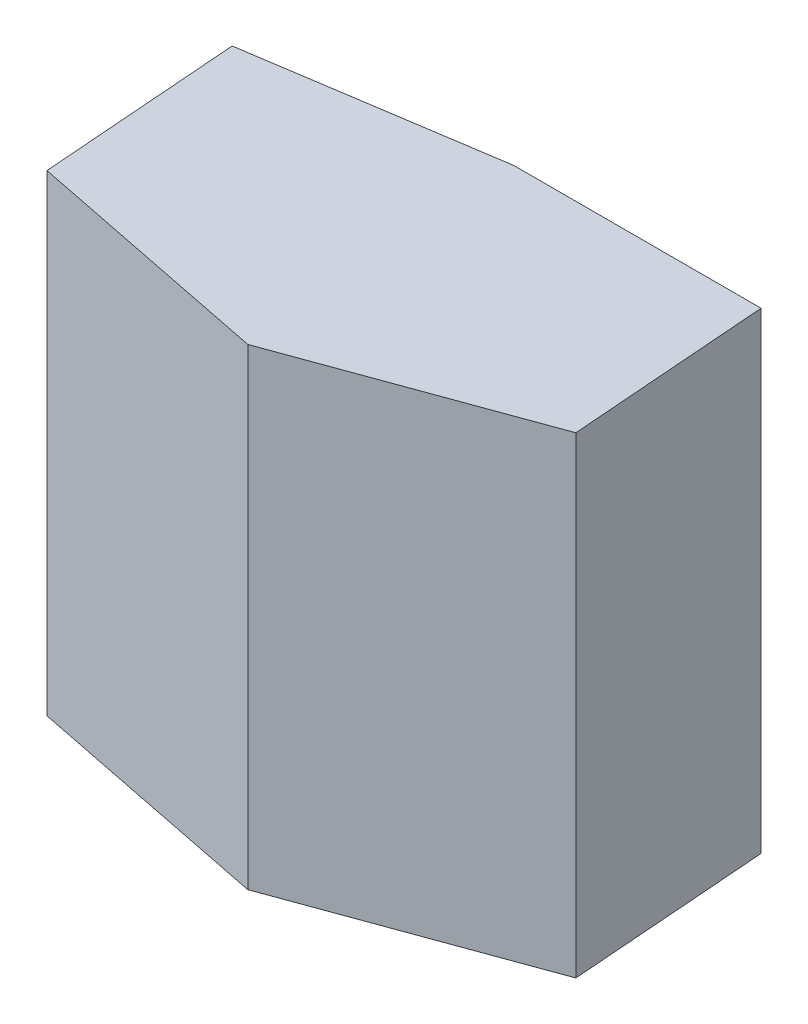
ISO-10303-21;
HEADER;
FILE_DESCRIPTION(('STEP AP214'),'2;1');
FILE_NAME('part.step','',(''),(''),'','','');
FILE_SCHEMA(('AUTOMOTIVE_DESIGN { 1 0 10303 214 1 1 1 1 }'));
ENDSEC;
DATA;
#1=APPLICATION_CONTEXT('core data for automotive mechanical design processes');
#2=APPLICATION_PROTOCOL_DEFINITION('international standard','automotive_design',2000,#1);
#3=PRODUCT_CONTEXT('',#1,'mechanical');
#4=PRODUCT('Part','Part','',(#3));
#5=PRODUCT_RELATED_PRODUCT_CATEGORY('part','',(#4));
#6=PRODUCT_DEFINITION_FORMATION('','',#4);
#7=PRODUCT_DEFINITION_CONTEXT('part definition',#1,'design');
#8=PRODUCT_DEFINITION('design','',#6,#7);
#9=PRODUCT_DEFINITION_SHAPE('','',#8);
#10=(LENGTH_UNIT() NAMED_UNIT(*) SI_UNIT(.MILLI.,.METRE.));
#11=(NAMED_UNIT(*) PLANE_ANGLE_UNIT() SI_UNIT($,.RADIAN.));
#12=(NAMED_UNIT(*) SI_UNIT($,.STERADIAN.) SOLID_ANGLE_UNIT());
#13=UNCERTAINTY_MEASURE_WITH_UNIT(LENGTH_MEASURE(1.E-05),#10,'distance_accuracy_value','');
#14=(GEOMETRIC_REPRESENTATION_CONTEXT(3) GLOBAL_UNCERTAINTY_ASSIGNED_CONTEXT((#13)) GLOBAL_UNIT_ASSIGNED_CONTEXT((#10,
#11,#12)) REPRESENTATION_CONTEXT('',''));
#15=CARTESIAN_POINT('',(0.,0.,0.));
#16=DIRECTION('',(0.,0.,1.));
#17=DIRECTION('',(1.,0.,0.));
#18=AXIS2_PLACEMENT_3D('',#15,#16,#17);
#19=CARTESIAN_POINT('',(-15.1608957547809,6.5,5.51811477955297));
#20=DIRECTION('',(-0.342020143325662,0.,-0.939692620785911));
#21=DIRECTION('',(-0.939692620785911,0.,0.342020143325662));
#22=AXIS2_PLACEMENT_3D('',#19,#20,#21);
#23=PLANE('',#22);
#24=DIRECTION('',(0.939692620785911,0.,-0.342020143325662));
#25=VECTOR('',#24,1.);
#26=CARTESIAN_POINT('',(-15.1608957547809,-6.5,5.51811477955297));
#27=LINE('',#26,#25);
#28=CARTESIAN_POINT('',(-21.7832392461402,-6.5,7.92845069149421));
#29=VERTEX_POINT('',#28);
#30=CARTESIAN_POINT('',(-15.1608957547809,-6.5,5.51811477955297));
#31=VERTEX_POINT('',#30);
#32=EDGE_CURVE('E69',#29,#31,#27,.T.);
#33=ORIENTED_EDGE('',*,*,#32,.T.);
#34=DIRECTION('',(0.,-1.,0.));
#35=VECTOR('',#34,1.);
#36=CARTESIAN_POINT('',(-15.1608957547809,6.5,5.51811477955297));
#37=LINE('',#36,#35);
#38=CARTESIAN_POINT('',(-15.1608957547809,6.5,5.51811477955297));
#39=VERTEX_POINT('',#38);
#40=EDGE_CURVE('E11',#39,#31,#37,.T.);
#41=ORIENTED_EDGE('',*,*,#40,.F.);
#42=DIRECTION('',(0.939692620785911,0.,-0.342020143325662));
#43=VECTOR('',#42,1.);
#44=CARTESIAN_POINT('',(-15.1608957547809,6.5,5.51811477955297));
#45=LINE('',#44,#43);
#46=CARTESIAN_POINT('',(-21.7832392461402,6.5,7.92845069149421));
#47=VERTEX_POINT('',#46);
#48=EDGE_CURVE('E80',#47,#39,#45,.T.);
#49=ORIENTED_EDGE('',*,*,#48,.F.);
#50=DIRECTION('',(0.,-1.,0.));
#51=VECTOR('',#50,1.);
#52=CARTESIAN_POINT('',(-21.7832392461402,6.5,7.92845069149421));
#53=LINE('',#52,#51);
#54=EDGE_CURVE('E116',#47,#29,#53,.T.);
#55=ORIENTED_EDGE('',*,*,#54,.T.);
#56=EDGE_LOOP('',(#33,#41,#49,#55));
#57=FACE_BOUND('',#56,.T.);
#58=ADVANCED_FACE('F39',(#57),#23,.F.);
#59=CARTESIAN_POINT('',(-15.5804579930704,6.5,0.));
#60=DIRECTION('',(-0.997121917262512,0.,0.0758147882324572));
#61=DIRECTION('',(0.0758147882324572,0.,0.997121917262512));
#62=AXIS2_PLACEMENT_3D('',#59,#60,#61);
#63=PLANE('',#62);
#64=DIRECTION('',(-0.0758147882324572,0.,-0.997121917262512));
#65=VECTOR('',#64,1.);
#66=CARTESIAN_POINT('',(-15.5804579930704,-6.5,0.));
#67=LINE('',#66,#65);
#68=CARTESIAN_POINT('',(-15.5804579930704,-6.5,0.));
#69=VERTEX_POINT('',#68);
#70=EDGE_CURVE('E75',#31,#69,#67,.T.);
#71=ORIENTED_EDGE('',*,*,#70,.T.);
#72=DIRECTION('',(0.,-1.,0.));
#73=VECTOR('',#72,1.);
#74=CARTESIAN_POINT('',(-15.5804579930704,6.5,0.));
#75=LINE('',#74,#73);
#76=CARTESIAN_POINT('',(-15.5804579930704,6.5,0.));
#77=VERTEX_POINT('',#76);
#78=EDGE_CURVE('E47',#77,#69,#75,.T.);
#79=ORIENTED_EDGE('',*,*,#78,.F.);
#80=DIRECTION('',(-0.0758147882324572,0.,-0.997121917262512));
#81=VECTOR('',#80,1.);
#82=CARTESIAN_POINT('',(-15.5804579930704,6.5,0.));
#83=LINE('',#82,#81);
#84=EDGE_CURVE('E135',#39,#77,#83,.T.);
#85=ORIENTED_EDGE('',*,*,#84,.F.);
#86=ORIENTED_EDGE('',*,*,#40,.T.);
#87=EDGE_LOOP('',(#71,#79,#85,#86));
#88=FACE_BOUND('',#87,.T.);
#89=ADVANCED_FACE('F157',(#88),#63,.F.);
#90=CARTESIAN_POINT('',(-22.3858503910373,6.5,0.));
#91=DIRECTION('',(0.,0.,1.));
#92=DIRECTION('',(1.,0.,0.));
#93=AXIS2_PLACEMENT_3D('',#90,#91,#92);
#94=PLANE('',#93);
#95=DIRECTION('',(-1.,0.,0.));
#96=VECTOR('',#95,1.);
#97=CARTESIAN_POINT('',(-22.3858503910373,-6.5,0.));
#98=LINE('',#97,#96);
#99=CARTESIAN_POINT('',(-22.3858503910373,-6.5,0.));
#100=VERTEX_POINT('',#99);
#101=EDGE_CURVE('E136',#69,#100,#98,.T.);
#102=ORIENTED_EDGE('',*,*,#101,.T.);
#103=DIRECTION('',(0.,-1.,0.));
#104=VECTOR('',#103,1.);
#105=CARTESIAN_POINT('',(-22.3858503910373,6.5,0.));
#106=LINE('',#105,#104);
#107=CARTESIAN_POINT('',(-22.3858503910373,6.5,0.));
#108=VERTEX_POINT('',#107);
#109=EDGE_CURVE('E126',#108,#100,#106,.T.);
#110=ORIENTED_EDGE('',*,*,#109,.F.);
#111=DIRECTION('',(-1.,0.,0.));
#112=VECTOR('',#111,1.);
#113=CARTESIAN_POINT('',(-22.3858503910373,6.5,0.));
#114=LINE('',#113,#112);
#115=EDGE_CURVE('E55',#77,#108,#114,.T.);
#116=ORIENTED_EDGE('',*,*,#115,.F.);
#117=ORIENTED_EDGE('',*,*,#78,.T.);
#118=EDGE_LOOP('',(#102,#110,#116,#117));
#119=FACE_BOUND('',#118,.T.);
#120=ADVANCED_FACE('F143',(#119),#94,.F.);
#121=CARTESIAN_POINT('',(0.,6.5,0.));
#122=DIRECTION('',(0.,-1.,0.));
#123=DIRECTION('',(0.,0.,-1.));
#124=AXIS2_PLACEMENT_3D('',#121,#122,#123);
#125=PLANE('',#124);
#126=ORIENTED_EDGE('',*,*,#115,.T.);
#127=DIRECTION('',(0.988512487886504,0.,-0.151139211630978));
#128=VECTOR('',#127,1.);
#129=CARTESIAN_POINT('',(-22.3858503910373,6.5,0.));
#130=LINE('',#129,#128);
#131=CARTESIAN_POINT('',(-29.1130657613954,6.5,1.02856164186817));
#132=VERTEX_POINT('',#131);
#133=EDGE_CURVE('E103',#132,#108,#130,.T.);
#134=ORIENTED_EDGE('',*,*,#133,.F.);
#135=DIRECTION('',(-0.0757603555407704,0.,-0.99712605448275));
#136=VECTOR('',#135,1.);
#137=CARTESIAN_POINT('',(-29.1130657613954,6.5,1.02856164186817));
#138=LINE('',#137,#136);
#139=CARTESIAN_POINT('',(-28.6938047559194,6.5,6.54669931697257));
#140=VERTEX_POINT('',#139);
#141=EDGE_CURVE('E96',#140,#132,#138,.T.);
#142=ORIENTED_EDGE('',*,*,#141,.F.);
#143=DIRECTION('',(-0.980590545245825,0.,-0.19606678090512));
#144=VECTOR('',#143,1.);
#145=CARTESIAN_POINT('',(-28.6938047559194,6.5,6.54669931697257));
#146=LINE('',#145,#144);
#147=EDGE_CURVE('E100',#47,#140,#146,.T.);
#148=ORIENTED_EDGE('',*,*,#147,.F.);
#149=ORIENTED_EDGE('',*,*,#48,.T.);
#150=ORIENTED_EDGE('',*,*,#84,.T.);
#151=EDGE_LOOP('',(#126,#134,#142,#148,#149,#150));
#152=FACE_BOUND('',#151,.T.);
#153=ADVANCED_FACE('F98',(#152),#125,.F.);
#154=CARTESIAN_POINT('',(0.,-6.5,0.));
#155=DIRECTION('',(0.,-1.,0.));
#156=DIRECTION('',(0.,0.,-1.));
#157=AXIS2_PLACEMENT_3D('',#154,#155,#156);
#158=PLANE('',#157);
#159=ORIENTED_EDGE('',*,*,#32,.F.);
#160=DIRECTION('',(-0.980590545245825,0.,-0.19606678090512));
#161=VECTOR('',#160,1.);
#162=CARTESIAN_POINT('',(-28.6938047559194,-6.5,6.54669931697257));
#163=LINE('',#162,#161);
#164=CARTESIAN_POINT('',(-28.6938047559194,-6.5,6.54669931697257));
#165=VERTEX_POINT('',#164);
#166=EDGE_CURVE('E127',#29,#165,#163,.T.);
#167=ORIENTED_EDGE('',*,*,#166,.T.);
#168=DIRECTION('',(-0.0757603555407704,0.,-0.99712605448275));
#169=VECTOR('',#168,1.);
#170=CARTESIAN_POINT('',(-29.1130657613954,-6.5,1.02856164186817));
#171=LINE('',#170,#169);
#172=CARTESIAN_POINT('',(-29.1130657613954,-6.5,1.02856164186817));
#173=VERTEX_POINT('',#172);
#174=EDGE_CURVE('E112',#165,#173,#171,.T.);
#175=ORIENTED_EDGE('',*,*,#174,.T.);
#176=DIRECTION('',(0.988512487886504,0.,-0.151139211630978));
#177=VECTOR('',#176,1.);
#178=CARTESIAN_POINT('',(-22.3858503910373,-6.5,0.));
#179=LINE('',#178,#177);
#180=EDGE_CURVE('E120',#173,#100,#179,.T.);
#181=ORIENTED_EDGE('',*,*,#180,.T.);
#182=ORIENTED_EDGE('',*,*,#101,.F.);
#183=ORIENTED_EDGE('',*,*,#70,.F.);
#184=EDGE_LOOP('',(#159,#167,#175,#181,#182,#183));
#185=FACE_BOUND('',#184,.T.);
#186=ADVANCED_FACE('F146',(#185),#158,.T.);
#187=CARTESIAN_POINT('',(-28.6938047559194,6.5,6.54669931697257));
#188=DIRECTION('',(0.196066780905119,0.,-0.980590545245825));
#189=DIRECTION('',(0.980590545245825,0.,0.196066780905119));
#190=AXIS2_PLACEMENT_3D('',#187,#188,#189);
#191=PLANE('',#190);
#192=ORIENTED_EDGE('',*,*,#166,.F.);
#193=ORIENTED_EDGE('',*,*,#54,.F.);
#194=ORIENTED_EDGE('',*,*,#147,.T.);
#195=DIRECTION('',(0.,-1.,0.));
#196=VECTOR('',#195,1.);
#197=CARTESIAN_POINT('',(-28.6938047559194,6.5,6.54669931697257));
#198=LINE('',#197,#196);
#199=EDGE_CURVE('E109',#140,#165,#198,.T.);
#200=ORIENTED_EDGE('',*,*,#199,.T.);
#201=EDGE_LOOP('',(#192,#193,#194,#200));
#202=FACE_BOUND('',#201,.T.);
#203=ADVANCED_FACE('F119',(#202),#191,.F.);
#204=CARTESIAN_POINT('',(-29.1130657613954,6.5,1.02856164186817));
#205=DIRECTION('',(0.99712605448275,0.,-0.0757603555407704));
#206=DIRECTION('',(0.0757603555407704,0.,0.99712605448275));
#207=AXIS2_PLACEMENT_3D('',#204,#205,#206);
#208=PLANE('',#207);
#209=ORIENTED_EDGE('',*,*,#174,.F.);
#210=ORIENTED_EDGE('',*,*,#199,.F.);
#211=ORIENTED_EDGE('',*,*,#141,.T.);
#212=DIRECTION('',(0.,-1.,0.));
#213=VECTOR('',#212,1.);
#214=CARTESIAN_POINT('',(-29.1130657613954,6.5,1.02856164186817));
#215=LINE('',#214,#213);
#216=EDGE_CURVE('E117',#132,#173,#215,.T.);
#217=ORIENTED_EDGE('',*,*,#216,.T.);
#218=EDGE_LOOP('',(#209,#210,#211,#217));
#219=FACE_BOUND('',#218,.T.);
#220=ADVANCED_FACE('F110',(#219),#208,.F.);
#221=CARTESIAN_POINT('',(-22.3858503910373,6.5,0.));
#222=DIRECTION('',(0.151139211630978,0.,0.988512487886504));
#223=DIRECTION('',(-0.988512487886504,0.,0.151139211630978));
#224=AXIS2_PLACEMENT_3D('',#221,#222,#223);
#225=PLANE('',#224);
#226=ORIENTED_EDGE('',*,*,#180,.F.);
#227=ORIENTED_EDGE('',*,*,#216,.F.);
#228=ORIENTED_EDGE('',*,*,#133,.T.);
#229=ORIENTED_EDGE('',*,*,#109,.T.);
#230=EDGE_LOOP('',(#226,#227,#228,#229));
#231=FACE_BOUND('',#230,.T.);
#232=ADVANCED_FACE('F148',(#231),#225,.F.);
#233=CLOSED_SHELL('',(#58,#89,#120,#153,#186,#203,#220,#232));
#234=MANIFOLD_SOLID_BREP('B2',#233);
#235=ADVANCED_BREP_SHAPE_REPRESENTATION('',(#18,#234),#14);
#236=SHAPE_DEFINITION_REPRESENTATION(#9,#235);
ENDSEC;
END-ISO-10303-21;
